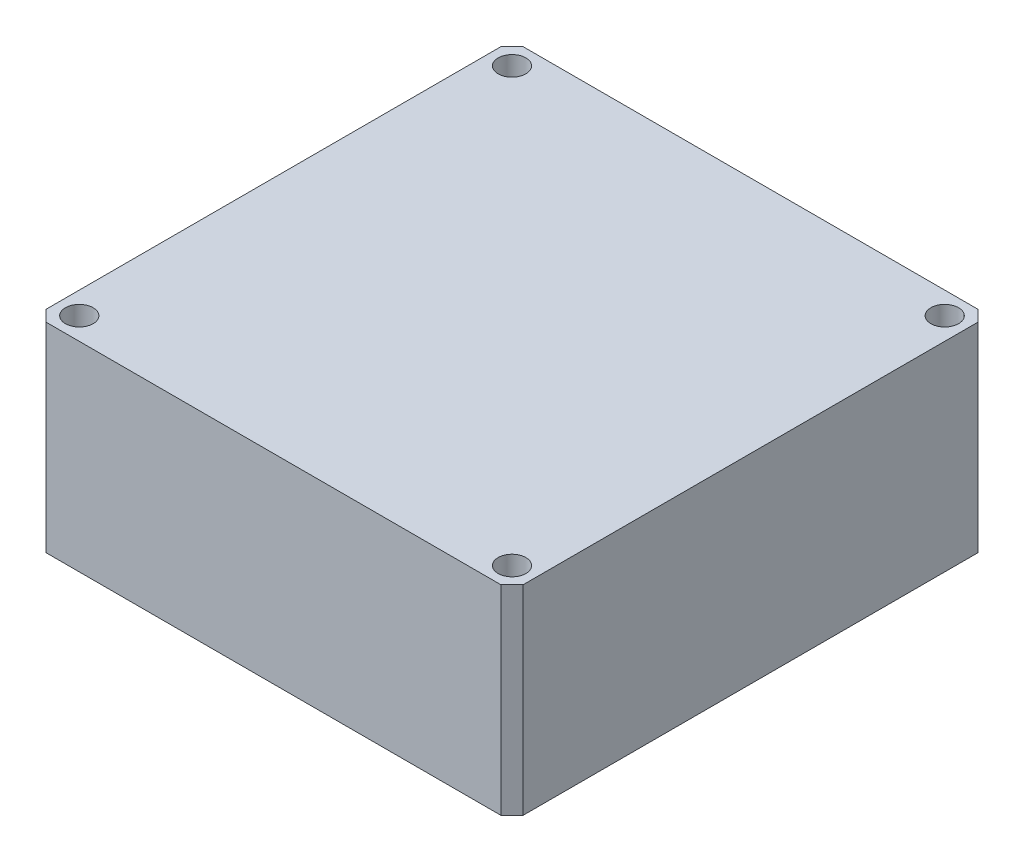
ISO-10303-21;
HEADER;
FILE_DESCRIPTION(('STEP AP214'),'2;1');
FILE_NAME('part.step','',(''),(''),'','','');
FILE_SCHEMA(('AUTOMOTIVE_DESIGN { 1 0 10303 214 1 1 1 1 }'));
ENDSEC;
DATA;
#1=APPLICATION_CONTEXT('core data for automotive mechanical design processes');
#2=APPLICATION_PROTOCOL_DEFINITION('international standard','automotive_design',2000,#1);
#3=PRODUCT_CONTEXT('',#1,'mechanical');
#4=PRODUCT('Part','Part','',(#3));
#5=PRODUCT_RELATED_PRODUCT_CATEGORY('part','',(#4));
#6=PRODUCT_DEFINITION_FORMATION('','',#4);
#7=PRODUCT_DEFINITION_CONTEXT('part definition',#1,'design');
#8=PRODUCT_DEFINITION('design','',#6,#7);
#9=PRODUCT_DEFINITION_SHAPE('','',#8);
#10=(LENGTH_UNIT() NAMED_UNIT(*) SI_UNIT(.MILLI.,.METRE.));
#11=(NAMED_UNIT(*) PLANE_ANGLE_UNIT() SI_UNIT($,.RADIAN.));
#12=(NAMED_UNIT(*) SI_UNIT($,.STERADIAN.) SOLID_ANGLE_UNIT());
#13=UNCERTAINTY_MEASURE_WITH_UNIT(LENGTH_MEASURE(1.E-05),#10,'distance_accuracy_value','');
#14=(GEOMETRIC_REPRESENTATION_CONTEXT(3) GLOBAL_UNCERTAINTY_ASSIGNED_CONTEXT((#13)) GLOBAL_UNIT_ASSIGNED_CONTEXT((#10,
#11,#12)) REPRESENTATION_CONTEXT('',''));
#15=CARTESIAN_POINT('',(0.,0.,0.));
#16=DIRECTION('',(0.,0.,1.));
#17=DIRECTION('',(1.,0.,0.));
#18=AXIS2_PLACEMENT_3D('',#15,#16,#17);
#19=CARTESIAN_POINT('',(-21.,9.,-21.));
#20=DIRECTION('',(-0.707106781186548,0.,-0.707106781186548));
#21=DIRECTION('',(-0.707106781186548,0.,0.707106781186548));
#22=AXIS2_PLACEMENT_3D('',#19,#20,#21);
#23=PLANE('',#22);
#24=DIRECTION('',(0.,1.,0.));
#25=VECTOR('',#24,1.);
#26=CARTESIAN_POINT('',(-20.5,0.,-21.5));
#27=LINE('',#26,#25);
#28=CARTESIAN_POINT('',(-20.5,0.,-21.5));
#29=VERTEX_POINT('',#28);
#30=CARTESIAN_POINT('',(-20.5,18.,-21.5));
#31=VERTEX_POINT('',#30);
#32=EDGE_CURVE('E85',#29,#31,#27,.T.);
#33=ORIENTED_EDGE('',*,*,#32,.F.);
#34=DIRECTION('',(-0.707106781186548,0.,0.707106781186548));
#35=VECTOR('',#34,1.);
#36=CARTESIAN_POINT('',(-21.,0.,-21.));
#37=LINE('',#36,#35);
#38=CARTESIAN_POINT('',(-21.5,0.,-20.5));
#39=VERTEX_POINT('',#38);
#40=EDGE_CURVE('E119',#29,#39,#37,.T.);
#41=ORIENTED_EDGE('',*,*,#40,.T.);
#42=DIRECTION('',(0.,1.,0.));
#43=VECTOR('',#42,1.);
#44=CARTESIAN_POINT('',(-21.5,0.,-20.5));
#45=LINE('',#44,#43);
#46=CARTESIAN_POINT('',(-21.5,18.,-20.5));
#47=VERTEX_POINT('',#46);
#48=EDGE_CURVE('E98',#47,#39,#45,.F.);
#49=ORIENTED_EDGE('',*,*,#48,.F.);
#50=DIRECTION('',(-0.707106781186547,0.,0.707106781186547));
#51=VECTOR('',#50,1.);
#52=CARTESIAN_POINT('',(-20.5,18.,-21.5));
#53=LINE('',#52,#51);
#54=EDGE_CURVE('E96',#31,#47,#53,.T.);
#55=ORIENTED_EDGE('',*,*,#54,.F.);
#56=EDGE_LOOP('',(#33,#41,#49,#55));
#57=FACE_BOUND('',#56,.T.);
#58=ADVANCED_FACE('F17',(#57),#23,.T.);
#59=CARTESIAN_POINT('',(-21.,9.,21.));
#60=DIRECTION('',(-0.707106781186548,0.,0.707106781186548));
#61=DIRECTION('',(0.707106781186548,0.,0.707106781186548));
#62=AXIS2_PLACEMENT_3D('',#59,#60,#61);
#63=PLANE('',#62);
#64=DIRECTION('',(0.,1.,0.));
#65=VECTOR('',#64,1.);
#66=CARTESIAN_POINT('',(-21.5,0.,20.5));
#67=LINE('',#66,#65);
#68=CARTESIAN_POINT('',(-21.5,0.,20.5));
#69=VERTEX_POINT('',#68);
#70=CARTESIAN_POINT('',(-21.5,18.,20.5));
#71=VERTEX_POINT('',#70);
#72=EDGE_CURVE('E107',#69,#71,#67,.T.);
#73=ORIENTED_EDGE('',*,*,#72,.F.);
#74=DIRECTION('',(0.707106781186548,0.,0.707106781186548));
#75=VECTOR('',#74,1.);
#76=CARTESIAN_POINT('',(-21.,0.,21.));
#77=LINE('',#76,#75);
#78=CARTESIAN_POINT('',(-20.5,0.,21.5));
#79=VERTEX_POINT('',#78);
#80=EDGE_CURVE('E117',#69,#79,#77,.T.);
#81=ORIENTED_EDGE('',*,*,#80,.T.);
#82=DIRECTION('',(0.,1.,0.));
#83=VECTOR('',#82,1.);
#84=CARTESIAN_POINT('',(-20.5,0.,21.5));
#85=LINE('',#84,#83);
#86=CARTESIAN_POINT('',(-20.5,18.,21.5));
#87=VERTEX_POINT('',#86);
#88=EDGE_CURVE('E159',#87,#79,#85,.F.);
#89=ORIENTED_EDGE('',*,*,#88,.F.);
#90=DIRECTION('',(0.707106781186547,0.,0.707106781186547));
#91=VECTOR('',#90,1.);
#92=CARTESIAN_POINT('',(-21.5,18.,20.5));
#93=LINE('',#92,#91);
#94=EDGE_CURVE('E101',#71,#87,#93,.T.);
#95=ORIENTED_EDGE('',*,*,#94,.F.);
#96=EDGE_LOOP('',(#73,#81,#89,#95));
#97=FACE_BOUND('',#96,.T.);
#98=ADVANCED_FACE('F176',(#97),#63,.T.);
#99=CARTESIAN_POINT('',(21.,9.,21.));
#100=DIRECTION('',(0.707106781186548,0.,0.707106781186548));
#101=DIRECTION('',(0.707106781186548,0.,-0.707106781186548));
#102=AXIS2_PLACEMENT_3D('',#99,#100,#101);
#103=PLANE('',#102);
#104=DIRECTION('',(0.,1.,0.));
#105=VECTOR('',#104,1.);
#106=CARTESIAN_POINT('',(20.5,0.,21.5));
#107=LINE('',#106,#105);
#108=CARTESIAN_POINT('',(20.5,0.,21.5));
#109=VERTEX_POINT('',#108);
#110=CARTESIAN_POINT('',(20.5,18.,21.5));
#111=VERTEX_POINT('',#110);
#112=EDGE_CURVE('E156',#109,#111,#107,.T.);
#113=ORIENTED_EDGE('',*,*,#112,.F.);
#114=DIRECTION('',(0.707106781186548,0.,-0.707106781186548));
#115=VECTOR('',#114,1.);
#116=CARTESIAN_POINT('',(21.,0.,21.));
#117=LINE('',#116,#115);
#118=CARTESIAN_POINT('',(21.5,0.,20.5));
#119=VERTEX_POINT('',#118);
#120=EDGE_CURVE('E35',#109,#119,#117,.T.);
#121=ORIENTED_EDGE('',*,*,#120,.T.);
#122=DIRECTION('',(0.,1.,0.));
#123=VECTOR('',#122,1.);
#124=CARTESIAN_POINT('',(21.5,0.,20.5));
#125=LINE('',#124,#123);
#126=CARTESIAN_POINT('',(21.5,18.,20.5));
#127=VERTEX_POINT('',#126);
#128=EDGE_CURVE('E144',#127,#119,#125,.F.);
#129=ORIENTED_EDGE('',*,*,#128,.F.);
#130=DIRECTION('',(0.707106781186547,0.,-0.707106781186547));
#131=VECTOR('',#130,1.);
#132=CARTESIAN_POINT('',(20.5,18.,21.5));
#133=LINE('',#132,#131);
#134=EDGE_CURVE('E112',#111,#127,#133,.T.);
#135=ORIENTED_EDGE('',*,*,#134,.F.);
#136=EDGE_LOOP('',(#113,#121,#129,#135));
#137=FACE_BOUND('',#136,.T.);
#138=ADVANCED_FACE('F183',(#137),#103,.T.);
#139=CARTESIAN_POINT('',(21.,9.,-21.));
#140=DIRECTION('',(0.707106781186548,0.,-0.707106781186548));
#141=DIRECTION('',(-0.707106781186548,0.,-0.707106781186548));
#142=AXIS2_PLACEMENT_3D('',#139,#140,#141);
#143=PLANE('',#142);
#144=DIRECTION('',(0.,1.,0.));
#145=VECTOR('',#144,1.);
#146=CARTESIAN_POINT('',(21.5,0.,-20.5));
#147=LINE('',#146,#145);
#148=CARTESIAN_POINT('',(21.5,0.,-20.5));
#149=VERTEX_POINT('',#148);
#150=CARTESIAN_POINT('',(21.5,18.,-20.5));
#151=VERTEX_POINT('',#150);
#152=EDGE_CURVE('E140',#149,#151,#147,.T.);
#153=ORIENTED_EDGE('',*,*,#152,.F.);
#154=DIRECTION('',(-0.707106781186548,0.,-0.707106781186548));
#155=VECTOR('',#154,1.);
#156=CARTESIAN_POINT('',(21.,0.,-21.));
#157=LINE('',#156,#155);
#158=CARTESIAN_POINT('',(20.5,0.,-21.5));
#159=VERTEX_POINT('',#158);
#160=EDGE_CURVE('E102',#149,#159,#157,.T.);
#161=ORIENTED_EDGE('',*,*,#160,.T.);
#162=DIRECTION('',(0.,1.,0.));
#163=VECTOR('',#162,1.);
#164=CARTESIAN_POINT('',(20.5,0.,-21.5));
#165=LINE('',#164,#163);
#166=CARTESIAN_POINT('',(20.5,18.,-21.5));
#167=VERTEX_POINT('',#166);
#168=EDGE_CURVE('E105',#167,#159,#165,.F.);
#169=ORIENTED_EDGE('',*,*,#168,.F.);
#170=DIRECTION('',(-0.707106781186547,0.,-0.707106781186547));
#171=VECTOR('',#170,1.);
#172=CARTESIAN_POINT('',(21.5,18.,-20.5));
#173=LINE('',#172,#171);
#174=EDGE_CURVE('E79',#151,#167,#173,.T.);
#175=ORIENTED_EDGE('',*,*,#174,.F.);
#176=EDGE_LOOP('',(#153,#161,#169,#175));
#177=FACE_BOUND('',#176,.T.);
#178=ADVANCED_FACE('F191',(#177),#143,.T.);
#179=CARTESIAN_POINT('',(0.,18.,0.));
#180=DIRECTION('',(0.,1.,0.));
#181=DIRECTION('',(0.,0.,1.));
#182=AXIS2_PLACEMENT_3D('',#179,#180,#181);
#183=PLANE('',#182);
#184=CARTESIAN_POINT('',(-19.5,18.,-19.5));
#185=DIRECTION('',(0.,1.,0.));
#186=DIRECTION('',(0.,0.,1.));
#187=AXIS2_PLACEMENT_3D('',#184,#185,#186);
#188=CIRCLE('',#187,1.25);
#189=CARTESIAN_POINT('',(-19.5,18.,-18.25));
#190=VERTEX_POINT('',#189);
#191=EDGE_CURVE('E130',#190,#190,#188,.F.);
#192=ORIENTED_EDGE('',*,*,#191,.T.);
#193=EDGE_LOOP('',(#192));
#194=FACE_BOUND('',#193,.T.);
#195=CARTESIAN_POINT('',(-19.5,18.,19.5));
#196=DIRECTION('',(0.,1.,0.));
#197=DIRECTION('',(0.,0.,1.));
#198=AXIS2_PLACEMENT_3D('',#195,#196,#197);
#199=CIRCLE('',#198,1.25);
#200=CARTESIAN_POINT('',(-19.5,18.,20.75));
#201=VERTEX_POINT('',#200);
#202=EDGE_CURVE('E133',#201,#201,#199,.F.);
#203=ORIENTED_EDGE('',*,*,#202,.T.);
#204=EDGE_LOOP('',(#203));
#205=FACE_BOUND('',#204,.T.);
#206=CARTESIAN_POINT('',(19.5,18.,19.5));
#207=DIRECTION('',(0.,1.,0.));
#208=DIRECTION('',(0.,0.,1.));
#209=AXIS2_PLACEMENT_3D('',#206,#207,#208);
#210=CIRCLE('',#209,1.25);
#211=CARTESIAN_POINT('',(19.5,18.,20.75));
#212=VERTEX_POINT('',#211);
#213=EDGE_CURVE('E135',#212,#212,#210,.F.);
#214=ORIENTED_EDGE('',*,*,#213,.T.);
#215=EDGE_LOOP('',(#214));
#216=FACE_BOUND('',#215,.T.);
#217=CARTESIAN_POINT('',(19.5,18.,-19.5));
#218=DIRECTION('',(0.,1.,0.));
#219=DIRECTION('',(0.,0.,1.));
#220=AXIS2_PLACEMENT_3D('',#217,#218,#219);
#221=CIRCLE('',#220,1.25);
#222=CARTESIAN_POINT('',(19.5,18.,-18.25));
#223=VERTEX_POINT('',#222);
#224=EDGE_CURVE('E20',#223,#223,#221,.F.);
#225=ORIENTED_EDGE('',*,*,#224,.T.);
#226=EDGE_LOOP('',(#225));
#227=FACE_BOUND('',#226,.T.);
#228=DIRECTION('',(0.,0.,-1.));
#229=VECTOR('',#228,1.);
#230=CARTESIAN_POINT('',(21.5,18.,21.5));
#231=LINE('',#230,#229);
#232=EDGE_CURVE('E150',#151,#127,#231,.F.);
#233=ORIENTED_EDGE('',*,*,#232,.F.);
#234=ORIENTED_EDGE('',*,*,#174,.T.);
#235=DIRECTION('',(-1.,0.,0.));
#236=VECTOR('',#235,1.);
#237=CARTESIAN_POINT('',(21.5,18.,-21.5));
#238=LINE('',#237,#236);
#239=EDGE_CURVE('E89',#31,#167,#238,.F.);
#240=ORIENTED_EDGE('',*,*,#239,.F.);
#241=ORIENTED_EDGE('',*,*,#54,.T.);
#242=DIRECTION('',(0.,0.,1.));
#243=VECTOR('',#242,1.);
#244=CARTESIAN_POINT('',(-21.5,18.,-21.5));
#245=LINE('',#244,#243);
#246=EDGE_CURVE('E166',#71,#47,#245,.F.);
#247=ORIENTED_EDGE('',*,*,#246,.F.);
#248=ORIENTED_EDGE('',*,*,#94,.T.);
#249=DIRECTION('',(1.,0.,0.));
#250=VECTOR('',#249,1.);
#251=CARTESIAN_POINT('',(-21.5,18.,21.5));
#252=LINE('',#251,#250);
#253=EDGE_CURVE('E162',#111,#87,#252,.F.);
#254=ORIENTED_EDGE('',*,*,#253,.F.);
#255=ORIENTED_EDGE('',*,*,#134,.T.);
#256=EDGE_LOOP('',(#233,#234,#240,#241,#247,#248,#254,#255));
#257=FACE_BOUND('',#256,.T.);
#258=ADVANCED_FACE('F104',(#194,#205,#216,#227,#257),#183,.T.);
#259=CARTESIAN_POINT('',(21.5,0.,-21.5));
#260=DIRECTION('',(0.,0.,-1.));
#261=DIRECTION('',(-1.,0.,0.));
#262=AXIS2_PLACEMENT_3D('',#259,#260,#261);
#263=PLANE('',#262);
#264=ORIENTED_EDGE('',*,*,#239,.T.);
#265=ORIENTED_EDGE('',*,*,#168,.T.);
#266=DIRECTION('',(1.,0.,0.));
#267=VECTOR('',#266,1.);
#268=CARTESIAN_POINT('',(0.,0.,-21.5));
#269=LINE('',#268,#267);
#270=EDGE_CURVE('E92',#159,#29,#269,.F.);
#271=ORIENTED_EDGE('',*,*,#270,.T.);
#272=ORIENTED_EDGE('',*,*,#32,.T.);
#273=EDGE_LOOP('',(#264,#265,#271,#272));
#274=FACE_BOUND('',#273,.T.);
#275=ADVANCED_FACE('F87',(#274),#263,.T.);
#276=CARTESIAN_POINT('',(-21.5,0.,-21.5));
#277=DIRECTION('',(-1.,0.,0.));
#278=DIRECTION('',(0.,0.,1.));
#279=AXIS2_PLACEMENT_3D('',#276,#277,#278);
#280=PLANE('',#279);
#281=ORIENTED_EDGE('',*,*,#246,.T.);
#282=ORIENTED_EDGE('',*,*,#48,.T.);
#283=DIRECTION('',(0.,0.,1.));
#284=VECTOR('',#283,1.);
#285=CARTESIAN_POINT('',(-21.5,0.,0.));
#286=LINE('',#285,#284);
#287=EDGE_CURVE('E173',#39,#69,#286,.T.);
#288=ORIENTED_EDGE('',*,*,#287,.T.);
#289=ORIENTED_EDGE('',*,*,#72,.T.);
#290=EDGE_LOOP('',(#281,#282,#288,#289));
#291=FACE_BOUND('',#290,.T.);
#292=ADVANCED_FACE('F171',(#291),#280,.T.);
#293=CARTESIAN_POINT('',(-21.5,0.,21.5));
#294=DIRECTION('',(0.,0.,1.));
#295=DIRECTION('',(1.,0.,0.));
#296=AXIS2_PLACEMENT_3D('',#293,#294,#295);
#297=PLANE('',#296);
#298=DIRECTION('',(1.,0.,0.));
#299=VECTOR('',#298,1.);
#300=CARTESIAN_POINT('',(0.,0.,21.5));
#301=LINE('',#300,#299);
#302=EDGE_CURVE('E182',#79,#109,#301,.T.);
#303=ORIENTED_EDGE('',*,*,#302,.T.);
#304=ORIENTED_EDGE('',*,*,#112,.T.);
#305=ORIENTED_EDGE('',*,*,#253,.T.);
#306=ORIENTED_EDGE('',*,*,#88,.T.);
#307=EDGE_LOOP('',(#303,#304,#305,#306));
#308=FACE_BOUND('',#307,.T.);
#309=ADVANCED_FACE('F180',(#308),#297,.T.);
#310=CARTESIAN_POINT('',(21.5,0.,21.5));
#311=DIRECTION('',(1.,0.,0.));
#312=DIRECTION('',(0.,0.,-1.));
#313=AXIS2_PLACEMENT_3D('',#310,#311,#312);
#314=PLANE('',#313);
#315=DIRECTION('',(0.,0.,1.));
#316=VECTOR('',#315,1.);
#317=CARTESIAN_POINT('',(21.5,0.,0.));
#318=LINE('',#317,#316);
#319=EDGE_CURVE('E129',#119,#149,#318,.F.);
#320=ORIENTED_EDGE('',*,*,#319,.T.);
#321=ORIENTED_EDGE('',*,*,#152,.T.);
#322=ORIENTED_EDGE('',*,*,#232,.T.);
#323=ORIENTED_EDGE('',*,*,#128,.T.);
#324=EDGE_LOOP('',(#320,#321,#322,#323));
#325=FACE_BOUND('',#324,.T.);
#326=ADVANCED_FACE('F184',(#325),#314,.T.);
#327=CARTESIAN_POINT('',(19.5,18.,-19.5));
#328=DIRECTION('',(0.,1.,0.));
#329=DIRECTION('',(0.,0.,1.));
#330=AXIS2_PLACEMENT_3D('',#327,#328,#329);
#331=CYLINDRICAL_SURFACE('',#330,1.25);
#332=ORIENTED_EDGE('',*,*,#224,.F.);
#333=EDGE_LOOP('',(#332));
#334=FACE_BOUND('',#333,.T.);
#335=CARTESIAN_POINT('',(19.5,0.,-19.5));
#336=DIRECTION('',(0.,1.,0.));
#337=DIRECTION('',(0.,0.,1.));
#338=AXIS2_PLACEMENT_3D('',#335,#336,#337);
#339=CIRCLE('',#338,1.25);
#340=CARTESIAN_POINT('',(19.5,0.,-18.25));
#341=VERTEX_POINT('',#340);
#342=EDGE_CURVE('E126',#341,#341,#339,.F.);
#343=ORIENTED_EDGE('',*,*,#342,.T.);
#344=EDGE_LOOP('',(#343));
#345=FACE_BOUND('',#344,.T.);
#346=ADVANCED_FACE('F221',(#334,#345),#331,.F.);
#347=CARTESIAN_POINT('',(19.5,18.,19.5));
#348=DIRECTION('',(0.,1.,0.));
#349=DIRECTION('',(0.,0.,1.));
#350=AXIS2_PLACEMENT_3D('',#347,#348,#349);
#351=CYLINDRICAL_SURFACE('',#350,1.25);
#352=ORIENTED_EDGE('',*,*,#213,.F.);
#353=EDGE_LOOP('',(#352));
#354=FACE_BOUND('',#353,.T.);
#355=CARTESIAN_POINT('',(19.5,0.,19.5));
#356=DIRECTION('',(0.,1.,0.));
#357=DIRECTION('',(0.,0.,1.));
#358=AXIS2_PLACEMENT_3D('',#355,#356,#357);
#359=CIRCLE('',#358,1.25);
#360=CARTESIAN_POINT('',(19.5,0.,20.75));
#361=VERTEX_POINT('',#360);
#362=EDGE_CURVE('E123',#361,#361,#359,.F.);
#363=ORIENTED_EDGE('',*,*,#362,.T.);
#364=EDGE_LOOP('',(#363));
#365=FACE_BOUND('',#364,.T.);
#366=ADVANCED_FACE('F217',(#354,#365),#351,.F.);
#367=CARTESIAN_POINT('',(-19.5,18.,19.5));
#368=DIRECTION('',(0.,1.,0.));
#369=DIRECTION('',(0.,0.,1.));
#370=AXIS2_PLACEMENT_3D('',#367,#368,#369);
#371=CYLINDRICAL_SURFACE('',#370,1.25);
#372=ORIENTED_EDGE('',*,*,#202,.F.);
#373=EDGE_LOOP('',(#372));
#374=FACE_BOUND('',#373,.T.);
#375=CARTESIAN_POINT('',(-19.5,0.,19.5));
#376=DIRECTION('',(0.,1.,0.));
#377=DIRECTION('',(0.,0.,1.));
#378=AXIS2_PLACEMENT_3D('',#375,#376,#377);
#379=CIRCLE('',#378,1.25);
#380=CARTESIAN_POINT('',(-19.5,0.,20.75));
#381=VERTEX_POINT('',#380);
#382=EDGE_CURVE('E26',#381,#381,#379,.F.);
#383=ORIENTED_EDGE('',*,*,#382,.T.);
#384=EDGE_LOOP('',(#383));
#385=FACE_BOUND('',#384,.T.);
#386=ADVANCED_FACE('F209',(#374,#385),#371,.F.);
#387=CARTESIAN_POINT('',(-19.5,18.,-19.5));
#388=DIRECTION('',(0.,1.,0.));
#389=DIRECTION('',(0.,0.,1.));
#390=AXIS2_PLACEMENT_3D('',#387,#388,#389);
#391=CYLINDRICAL_SURFACE('',#390,1.25);
#392=ORIENTED_EDGE('',*,*,#191,.F.);
#393=EDGE_LOOP('',(#392));
#394=FACE_BOUND('',#393,.T.);
#395=CARTESIAN_POINT('',(-19.5,0.,-19.5));
#396=DIRECTION('',(0.,1.,0.));
#397=DIRECTION('',(0.,0.,1.));
#398=AXIS2_PLACEMENT_3D('',#395,#396,#397);
#399=CIRCLE('',#398,1.25);
#400=CARTESIAN_POINT('',(-19.5,0.,-18.25));
#401=VERTEX_POINT('',#400);
#402=EDGE_CURVE('E11',#401,#401,#399,.F.);
#403=ORIENTED_EDGE('',*,*,#402,.T.);
#404=EDGE_LOOP('',(#403));
#405=FACE_BOUND('',#404,.T.);
#406=ADVANCED_FACE('F203',(#394,#405),#391,.F.);
#407=CARTESIAN_POINT('',(0.,0.,0.));
#408=DIRECTION('',(0.,1.,0.));
#409=DIRECTION('',(0.,0.,1.));
#410=AXIS2_PLACEMENT_3D('',#407,#408,#409);
#411=PLANE('',#410);
#412=ORIENTED_EDGE('',*,*,#402,.F.);
#413=EDGE_LOOP('',(#412));
#414=FACE_BOUND('',#413,.T.);
#415=ORIENTED_EDGE('',*,*,#382,.F.);
#416=EDGE_LOOP('',(#415));
#417=FACE_BOUND('',#416,.T.);
#418=ORIENTED_EDGE('',*,*,#362,.F.);
#419=EDGE_LOOP('',(#418));
#420=FACE_BOUND('',#419,.T.);
#421=ORIENTED_EDGE('',*,*,#342,.F.);
#422=EDGE_LOOP('',(#421));
#423=FACE_BOUND('',#422,.T.);
#424=ORIENTED_EDGE('',*,*,#120,.F.);
#425=ORIENTED_EDGE('',*,*,#302,.F.);
#426=ORIENTED_EDGE('',*,*,#80,.F.);
#427=ORIENTED_EDGE('',*,*,#287,.F.);
#428=ORIENTED_EDGE('',*,*,#40,.F.);
#429=ORIENTED_EDGE('',*,*,#270,.F.);
#430=ORIENTED_EDGE('',*,*,#160,.F.);
#431=ORIENTED_EDGE('',*,*,#319,.F.);
#432=EDGE_LOOP('',(#424,#425,#426,#427,#428,#429,#430,#431));
#433=FACE_BOUND('',#432,.T.);
#434=ADVANCED_FACE('F187',(#414,#417,#420,#423,#433),#411,.F.);
#435=CLOSED_SHELL('',(#58,#98,#138,#178,#258,#275,#292,#309,#326,#346,#366,#386,#406,#434));
#436=MANIFOLD_SOLID_BREP('B1',#435);
#437=ADVANCED_BREP_SHAPE_REPRESENTATION('',(#18,#436),#14);
#438=SHAPE_DEFINITION_REPRESENTATION(#9,#437);
ENDSEC;
END-ISO-10303-21;
